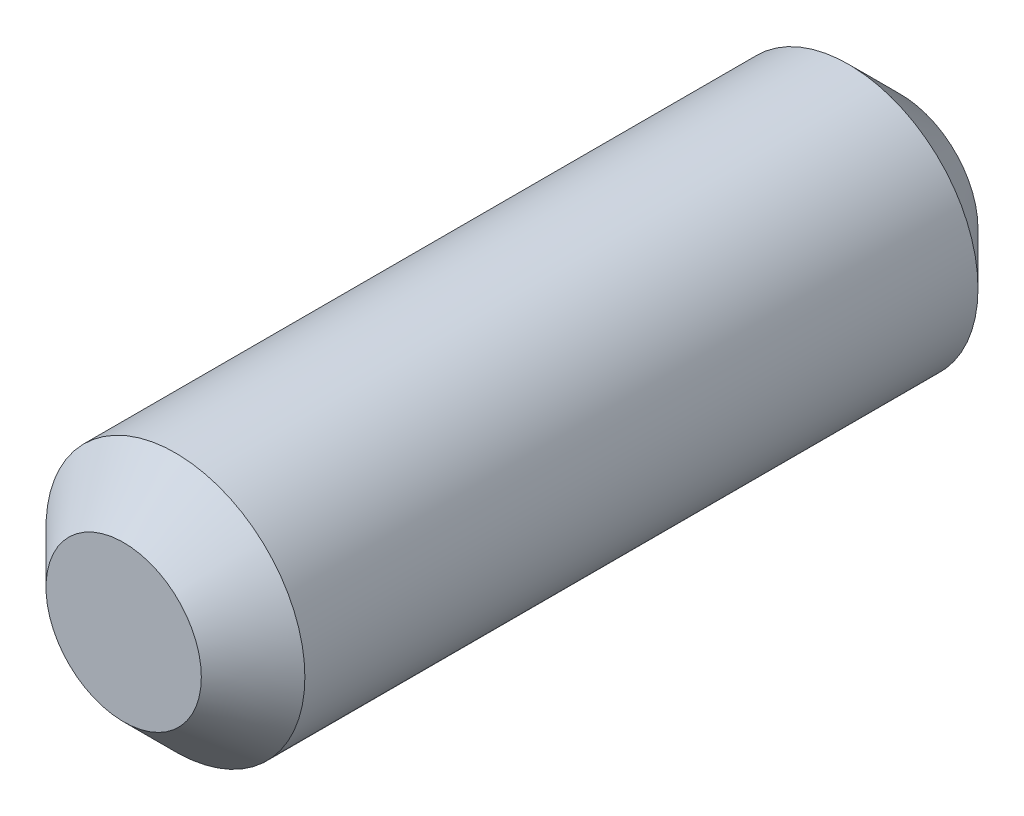
ISO-10303-21;
HEADER;
FILE_DESCRIPTION(('STEP AP214'),'2;1');
FILE_NAME('part.step','',(''),(''),'','','');
FILE_SCHEMA(('AUTOMOTIVE_DESIGN { 1 0 10303 214 1 1 1 1 }'));
ENDSEC;
DATA;
#1=APPLICATION_CONTEXT('core data for automotive mechanical design processes');
#2=APPLICATION_PROTOCOL_DEFINITION('international standard','automotive_design',2000,#1);
#3=PRODUCT_CONTEXT('',#1,'mechanical');
#4=PRODUCT('Part','Part','',(#3));
#5=PRODUCT_RELATED_PRODUCT_CATEGORY('part','',(#4));
#6=PRODUCT_DEFINITION_FORMATION('','',#4);
#7=PRODUCT_DEFINITION_CONTEXT('part definition',#1,'design');
#8=PRODUCT_DEFINITION('design','',#6,#7);
#9=PRODUCT_DEFINITION_SHAPE('','',#8);
#10=(LENGTH_UNIT() NAMED_UNIT(*) SI_UNIT(.MILLI.,.METRE.));
#11=(NAMED_UNIT(*) PLANE_ANGLE_UNIT() SI_UNIT($,.RADIAN.));
#12=(NAMED_UNIT(*) SI_UNIT($,.STERADIAN.) SOLID_ANGLE_UNIT());
#13=UNCERTAINTY_MEASURE_WITH_UNIT(LENGTH_MEASURE(1.E-05),#10,'distance_accuracy_value','');
#14=(GEOMETRIC_REPRESENTATION_CONTEXT(3) GLOBAL_UNCERTAINTY_ASSIGNED_CONTEXT((#13)) GLOBAL_UNIT_ASSIGNED_CONTEXT((#10,
#11,#12)) REPRESENTATION_CONTEXT('',''));
#15=CARTESIAN_POINT('',(0.,0.,0.));
#16=DIRECTION('',(0.,0.,1.));
#17=DIRECTION('',(1.,0.,0.));
#18=AXIS2_PLACEMENT_3D('',#15,#16,#17);
#19=CARTESIAN_POINT('',(0.,0.,30.));
#20=DIRECTION('',(0.,0.,-1.));
#21=DIRECTION('',(-1.,0.,0.));
#22=AXIS2_PLACEMENT_3D('',#19,#20,#21);
#23=CYLINDRICAL_SURFACE('',#22,5.);
#24=CARTESIAN_POINT('',(0.,0.,2.00000000000004));
#25=DIRECTION('',(0.,0.,1.));
#26=DIRECTION('',(1.,0.,0.));
#27=AXIS2_PLACEMENT_3D('',#24,#25,#26);
#28=CIRCLE('',#27,5.);
#29=CARTESIAN_POINT('',(5.,0.,2.00000000000004));
#30=VERTEX_POINT('',#29);
#31=EDGE_CURVE('E34',#30,#30,#28,.T.);
#32=ORIENTED_EDGE('',*,*,#31,.T.);
#33=EDGE_LOOP('',(#32));
#34=FACE_BOUND('',#33,.T.);
#35=CARTESIAN_POINT('',(0.,0.,28.));
#36=DIRECTION('',(0.,0.,1.));
#37=DIRECTION('',(1.,0.,0.));
#38=AXIS2_PLACEMENT_3D('',#35,#36,#37);
#39=CIRCLE('',#38,5.);
#40=CARTESIAN_POINT('',(5.,0.,28.));
#41=VERTEX_POINT('',#40);
#42=EDGE_CURVE('E38',#41,#41,#39,.F.);
#43=ORIENTED_EDGE('',*,*,#42,.T.);
#44=EDGE_LOOP('',(#43));
#45=FACE_BOUND('',#44,.T.);
#46=ADVANCED_FACE('F24',(#34,#45),#23,.T.);
#47=CARTESIAN_POINT('',(0.,0.,30.));
#48=DIRECTION('',(0.,0.,1.));
#49=DIRECTION('',(1.,0.,0.));
#50=AXIS2_PLACEMENT_3D('',#47,#48,#49);
#51=PLANE('',#50);
#52=CARTESIAN_POINT('',(0.,0.,30.));
#53=DIRECTION('',(0.,0.,1.));
#54=DIRECTION('',(1.,0.,0.));
#55=AXIS2_PLACEMENT_3D('',#52,#53,#54);
#56=CIRCLE('',#55,2.99999999999996);
#57=CARTESIAN_POINT('',(2.99999999999996,0.,30.));
#58=VERTEX_POINT('',#57);
#59=EDGE_CURVE('E10',#58,#58,#56,.T.);
#60=ORIENTED_EDGE('',*,*,#59,.T.);
#61=EDGE_LOOP('',(#60));
#62=FACE_BOUND('',#61,.T.);
#63=ADVANCED_FACE('F57',(#62),#51,.T.);
#64=CARTESIAN_POINT('',(0.,0.,0.));
#65=DIRECTION('',(0.,0.,1.));
#66=DIRECTION('',(1.,0.,0.));
#67=AXIS2_PLACEMENT_3D('',#64,#65,#66);
#68=PLANE('',#67);
#69=CARTESIAN_POINT('',(0.,0.,0.));
#70=DIRECTION('',(0.,0.,1.));
#71=DIRECTION('',(1.,0.,0.));
#72=AXIS2_PLACEMENT_3D('',#69,#70,#71);
#73=CIRCLE('',#72,2.99999999999998);
#74=CARTESIAN_POINT('',(2.99999999999998,0.,0.));
#75=VERTEX_POINT('',#74);
#76=EDGE_CURVE('E30',#75,#75,#73,.F.);
#77=ORIENTED_EDGE('',*,*,#76,.T.);
#78=EDGE_LOOP('',(#77));
#79=FACE_BOUND('',#78,.T.);
#80=ADVANCED_FACE('F53',(#79),#68,.F.);
#81=CARTESIAN_POINT('',(0.,0.,2.00000000000004));
#82=DIRECTION('',(0.,0.,1.));
#83=DIRECTION('',(1.,0.,0.));
#84=AXIS2_PLACEMENT_3D('',#81,#82,#83);
#85=CONICAL_SURFACE('',#84,5.,0.785398163397443);
#86=ORIENTED_EDGE('',*,*,#76,.F.);
#87=EDGE_LOOP('',(#86));
#88=FACE_BOUND('',#87,.T.);
#89=ORIENTED_EDGE('',*,*,#31,.F.);
#90=EDGE_LOOP('',(#89));
#91=FACE_BOUND('',#90,.T.);
#92=ADVANCED_FACE('F48',(#88,#91),#85,.T.);
#93=CARTESIAN_POINT('',(0.,0.,30.));
#94=DIRECTION('',(0.,0.,-1.));
#95=DIRECTION('',(-1.,0.,0.));
#96=AXIS2_PLACEMENT_3D('',#93,#94,#95);
#97=CONICAL_SURFACE('',#96,2.99999999999996,0.785398163397453);
#98=ORIENTED_EDGE('',*,*,#42,.F.);
#99=EDGE_LOOP('',(#98));
#100=FACE_BOUND('',#99,.T.);
#101=ORIENTED_EDGE('',*,*,#59,.F.);
#102=EDGE_LOOP('',(#101));
#103=FACE_BOUND('',#102,.T.);
#104=ADVANCED_FACE('F45',(#100,#103),#97,.T.);
#105=CLOSED_SHELL('',(#46,#63,#80,#92,#104));
#106=MANIFOLD_SOLID_BREP('B2',#105);
#107=ADVANCED_BREP_SHAPE_REPRESENTATION('',(#18,#106),#14);
#108=SHAPE_DEFINITION_REPRESENTATION(#9,#107);
ENDSEC;
END-ISO-10303-21;
